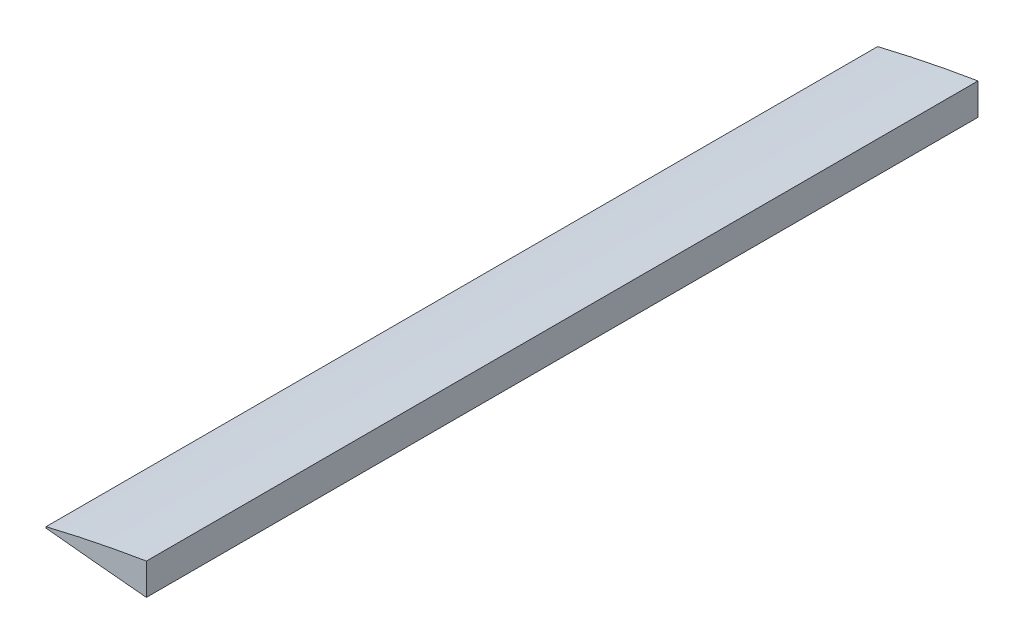
ISO-10303-21;
HEADER;
FILE_DESCRIPTION(('STEP AP214'),'2;1');
FILE_NAME('part.step','',(''),(''),'','','');
FILE_SCHEMA(('AUTOMOTIVE_DESIGN { 1 0 10303 214 1 1 1 1 }'));
ENDSEC;
DATA;
#1=APPLICATION_CONTEXT('core data for automotive mechanical design processes');
#2=APPLICATION_PROTOCOL_DEFINITION('international standard','automotive_design',2000,#1);
#3=PRODUCT_CONTEXT('',#1,'mechanical');
#4=PRODUCT('Part','Part','',(#3));
#5=PRODUCT_RELATED_PRODUCT_CATEGORY('part','',(#4));
#6=PRODUCT_DEFINITION_FORMATION('','',#4);
#7=PRODUCT_DEFINITION_CONTEXT('part definition',#1,'design');
#8=PRODUCT_DEFINITION('design','',#6,#7);
#9=PRODUCT_DEFINITION_SHAPE('','',#8);
#10=(LENGTH_UNIT() NAMED_UNIT(*) SI_UNIT(.MILLI.,.METRE.));
#11=(NAMED_UNIT(*) PLANE_ANGLE_UNIT() SI_UNIT($,.RADIAN.));
#12=(NAMED_UNIT(*) SI_UNIT($,.STERADIAN.) SOLID_ANGLE_UNIT());
#13=UNCERTAINTY_MEASURE_WITH_UNIT(LENGTH_MEASURE(1.E-05),#10,'distance_accuracy_value','');
#14=(GEOMETRIC_REPRESENTATION_CONTEXT(3) GLOBAL_UNCERTAINTY_ASSIGNED_CONTEXT((#13)) GLOBAL_UNIT_ASSIGNED_CONTEXT((#10,
#11,#12)) REPRESENTATION_CONTEXT('',''));
#15=CARTESIAN_POINT('',(0.,0.,0.));
#16=DIRECTION('',(0.,0.,1.));
#17=DIRECTION('',(1.,0.,0.));
#18=AXIS2_PLACEMENT_3D('',#15,#16,#17);
#19=CARTESIAN_POINT('',(-210.29024,15.5058314522249,612.));
#20=CARTESIAN_POINT('',(-212.448163353275,15.1479340687311,612.));
#21=CARTESIAN_POINT('',(-217.698820474475,14.2770984839323,612.));
#22=CARTESIAN_POINT('',(-225.855056301461,12.8241428399332,612.));
#23=CARTESIAN_POINT('',(-234.57385963361,11.2047682892585,612.));
#24=CARTESIAN_POINT('',(-242.716368314428,9.61995396378064,612.));
#25=CARTESIAN_POINT('',(-250.234652112608,8.09676921778001,612.));
#26=CARTESIAN_POINT('',(-257.0840012335,6.6572410943926,612.));
#27=CARTESIAN_POINT('',(-263.224123516304,5.32391997928555,612.));
#28=CARTESIAN_POINT('',(-268.619097385422,4.11810915980885,612.));
#29=CARTESIAN_POINT('',(-273.237578484398,3.05976006784548,612.));
#30=CARTESIAN_POINT('',(-277.052897894547,2.16689109478463,612.));
#31=CARTESIAN_POINT('',(-280.043162129704,1.45515688166644,612.));
#32=CARTESIAN_POINT('',(-282.191276140311,0.937226777434344,612.));
#33=CARTESIAN_POINT('',(-283.475130042903,0.625092250465188,612.));
#34=CARTESIAN_POINT('',(-284.041595767765,0.486694399645982,612.));
#35=CARTESIAN_POINT('',(-284.176,0.453857007963045,612.));
#36=B_SPLINE_CURVE_WITH_KNOTS('',3,(#19,#20,#21,#22,#23,#24,#25,#26,#27,#28,#29,#30,#31,#32,#33,
#34,#35),.UNSPECIFIED.,.F.,.F.,(4,1,1,1,1,1,1,1,1,1,1,1,1,1,4),(0.,0.0870070051452901,
0.21170536500617,0.329527112719374,0.439740644540536,0.541660709078569,0.634652346186562,
0.718134668905483,0.791584505134145,0.854539888493236,0.906603358473801,0.947445002011979,
0.976805146454738,0.994496601743555,1.),.UNSPECIFIED.);
#37=DIRECTION('',(0.,0.,-1.));
#38=VECTOR('',#37,1.);
#39=SURFACE_OF_LINEAR_EXTRUSION('',#36,#38);
#40=CARTESIAN_POINT('',(-210.29024,15.5058314522249,0.));
#41=CARTESIAN_POINT('',(-212.448163353275,15.1479340687311,0.));
#42=CARTESIAN_POINT('',(-217.698820474475,14.2770984839323,0.));
#43=CARTESIAN_POINT('',(-225.855056301461,12.8241428399332,0.));
#44=CARTESIAN_POINT('',(-234.57385963361,11.2047682892585,0.));
#45=CARTESIAN_POINT('',(-242.716368314428,9.61995396378064,0.));
#46=CARTESIAN_POINT('',(-250.234652112608,8.09676921778001,0.));
#47=CARTESIAN_POINT('',(-257.0840012335,6.6572410943926,0.));
#48=CARTESIAN_POINT('',(-263.224123516304,5.32391997928555,0.));
#49=CARTESIAN_POINT('',(-268.619097385422,4.11810915980885,0.));
#50=CARTESIAN_POINT('',(-273.237578484398,3.05976006784548,0.));
#51=CARTESIAN_POINT('',(-277.052897894547,2.16689109478463,0.));
#52=CARTESIAN_POINT('',(-280.043162129704,1.45515688166644,0.));
#53=CARTESIAN_POINT('',(-282.191276140311,0.937226777434344,0.));
#54=CARTESIAN_POINT('',(-283.475130042903,0.625092250465188,0.));
#55=CARTESIAN_POINT('',(-284.041595767765,0.486694399645982,0.));
#56=CARTESIAN_POINT('',(-284.176,0.453857007963045,0.));
#57=B_SPLINE_CURVE_WITH_KNOTS('',3,(#40,#41,#42,#43,#44,#45,#46,#47,#48,#49,#50,#51,#52,#53,#54,
#55,#56),.UNSPECIFIED.,.F.,.F.,(4,1,1,1,1,1,1,1,1,1,1,1,1,1,4),(0.,0.0870070051452901,
0.21170536500617,0.329527112719374,0.439740644540536,0.541660709078569,0.634652346186562,
0.718134668905483,0.791584505134145,0.854539888493236,0.906603358473801,0.947445002011979,
0.976805146454738,0.994496601743555,1.),.UNSPECIFIED.);
#58=CARTESIAN_POINT('',(-210.29024,15.5058314522249,0.));
#59=VERTEX_POINT('',#58);
#60=CARTESIAN_POINT('',(-284.176,0.453857007963045,0.));
#61=VERTEX_POINT('',#60);
#62=EDGE_CURVE('E134',#59,#61,#57,.T.);
#63=ORIENTED_EDGE('',*,*,#62,.T.);
#64=DIRECTION('',(0.,0.,-1.));
#65=VECTOR('',#64,1.);
#66=CARTESIAN_POINT('',(-284.176,0.453857007963045,612.));
#67=LINE('',#66,#65);
#68=CARTESIAN_POINT('',(-284.176,0.453857007963045,612.));
#69=VERTEX_POINT('',#68);
#70=EDGE_CURVE('E184',#69,#61,#67,.T.);
#71=ORIENTED_EDGE('',*,*,#70,.F.);
#72=CARTESIAN_POINT('',(-210.29024,15.5058314522249,612.));
#73=VERTEX_POINT('',#72);
#74=EDGE_CURVE('E147',#73,#69,#36,.T.);
#75=ORIENTED_EDGE('',*,*,#74,.F.);
#76=DIRECTION('',(0.,0.,-1.));
#77=VECTOR('',#76,1.);
#78=CARTESIAN_POINT('',(-210.29024,15.5058314522249,612.));
#79=LINE('',#78,#77);
#80=EDGE_CURVE('E204',#73,#59,#79,.T.);
#81=ORIENTED_EDGE('',*,*,#80,.T.);
#82=EDGE_LOOP('',(#63,#71,#75,#81));
#83=FACE_BOUND('',#82,.T.);
#84=ADVANCED_FACE('F39',(#83),#39,.F.);
#85=CARTESIAN_POINT('',(-284.176,0.453857007963045,612.));
#86=DIRECTION('',(1.,0.,0.));
#87=DIRECTION('',(0.,0.,-1.));
#88=AXIS2_PLACEMENT_3D('',#85,#86,#87);
#89=PLANE('',#88);
#90=DIRECTION('',(0.,-1.,0.));
#91=VECTOR('',#90,1.);
#92=CARTESIAN_POINT('',(-284.176,0.453857007963045,0.));
#93=LINE('',#92,#91);
#94=CARTESIAN_POINT('',(-284.176,-0.446585887155011,0.));
#95=VERTEX_POINT('',#94);
#96=EDGE_CURVE('E179',#61,#95,#93,.T.);
#97=ORIENTED_EDGE('',*,*,#96,.T.);
#98=DIRECTION('',(0.,0.,-1.));
#99=VECTOR('',#98,1.);
#100=CARTESIAN_POINT('',(-284.176,-0.446585887155011,612.));
#101=LINE('',#100,#99);
#102=CARTESIAN_POINT('',(-284.176,-0.446585887155011,612.));
#103=VERTEX_POINT('',#102);
#104=EDGE_CURVE('E181',#103,#95,#101,.T.);
#105=ORIENTED_EDGE('',*,*,#104,.F.);
#106=DIRECTION('',(0.,-1.,0.));
#107=VECTOR('',#106,1.);
#108=CARTESIAN_POINT('',(-284.176,0.453857007963045,612.));
#109=LINE('',#108,#107);
#110=EDGE_CURVE('E94',#69,#103,#109,.T.);
#111=ORIENTED_EDGE('',*,*,#110,.F.);
#112=ORIENTED_EDGE('',*,*,#70,.T.);
#113=EDGE_LOOP('',(#97,#105,#111,#112));
#114=FACE_BOUND('',#113,.T.);
#115=ADVANCED_FACE('F170',(#114),#89,.F.);
#116=CARTESIAN_POINT('',(-284.176,-0.446585887155011,612.));
#117=CARTESIAN_POINT('',(-284.166073983192,-0.446550556465792,612.));
#118=CARTESIAN_POINT('',(-284.007600869438,-0.445986486865687,612.));
#119=CARTESIAN_POINT('',(-283.409976300944,-0.546659804662299,612.));
#120=CARTESIAN_POINT('',(-282.084971372146,-0.653321357836059,612.));
#121=CARTESIAN_POINT('',(-279.890503933711,-0.906023665877273,612.));
#122=CARTESIAN_POINT('',(-276.83669848881,-1.21907284104337,612.));
#123=CARTESIAN_POINT('',(-272.945834405881,-1.6281931925168,612.));
#124=CARTESIAN_POINT('',(-268.242600772352,-2.11178080190877,612.));
#125=CARTESIAN_POINT('',(-262.758082865926,-2.67007960663762,612.));
#126=CARTESIAN_POINT('',(-256.527861272268,-3.29477004091561,612.));
#127=CARTESIAN_POINT('',(-249.592304466849,-3.98011450002054,612.));
#128=CARTESIAN_POINT('',(-241.996045088026,-4.71925279025023,612.));
#129=CARTESIAN_POINT('',(-233.787735511311,-5.50572775187703,612.));
#130=CARTESIAN_POINT('',(-225.019553340548,-6.33168785215731,612.));
#131=CARTESIAN_POINT('',(-217.124973788987,-7.06522307018421,612.));
#132=CARTESIAN_POINT('',(-212.158655952302,-7.51544881591709,612.));
#133=CARTESIAN_POINT('',(-210.29024,-7.68483164503255,612.));
#134=B_SPLINE_CURVE_WITH_KNOTS('',3,(#116,#117,#118,#119,#120,#121,#122,#123,#124,#125,#126,
#127,#128,#129,#130,#131,#132,#133),.UNSPECIFIED.,.F.,.F.,(4,1,1,1,1,1,1,1,1,1,1,1,1,1,1,4),(0.,
0.000401027004237275,0.00640256804801398,0.0243667405419057,0.0541726551316402,
0.0956203448841406,0.148432949269866,0.212259606924723,0.286678920603446,0.371202853061501,
0.465280924763119,0.568304609739684,0.67961185947699,0.798491720853711,0.924189047970983,1.),.UNSPECIFIED.);
#135=DIRECTION('',(0.,0.,-1.));
#136=VECTOR('',#135,1.);
#137=SURFACE_OF_LINEAR_EXTRUSION('',#134,#136);
#138=DIRECTION('',(0.,0.,-1.));
#139=VECTOR('',#138,1.);
#140=CARTESIAN_POINT('',(-233.632,-5.51822994875993,612.));
#141=LINE('',#140,#139);
#142=CARTESIAN_POINT('',(-233.632,-5.5182299496552,96.8999999999999));
#143=VERTEX_POINT('',#142);
#144=CARTESIAN_POINT('',(-233.631999990573,-5.5182299496552,83.8999999999999));
#145=VERTEX_POINT('',#144);
#146=EDGE_CURVE('E49',#143,#145,#141,.T.);
#147=ORIENTED_EDGE('',*,*,#146,.F.);
#148=CARTESIAN_POINT('',(-284.176,-0.446585887155011,96.9));
#149=CARTESIAN_POINT('',(-284.166073983192,-0.446550556465792,96.9));
#150=CARTESIAN_POINT('',(-284.007600869438,-0.445986486865687,96.9));
#151=CARTESIAN_POINT('',(-283.409976300944,-0.546659804662299,96.9));
#152=CARTESIAN_POINT('',(-282.084971372146,-0.653321357836059,96.9));
#153=CARTESIAN_POINT('',(-279.890503933711,-0.906023665877273,96.9));
#154=CARTESIAN_POINT('',(-276.83669848881,-1.21907284104337,96.9));
#155=CARTESIAN_POINT('',(-272.945834405881,-1.6281931925168,96.9));
#156=CARTESIAN_POINT('',(-268.242600772352,-2.11178080190877,96.9));
#157=CARTESIAN_POINT('',(-262.758082865926,-2.67007960663762,96.9));
#158=CARTESIAN_POINT('',(-256.527861272268,-3.29477004091561,96.9));
#159=CARTESIAN_POINT('',(-249.592304466849,-3.98011450002054,96.9));
#160=CARTESIAN_POINT('',(-241.996045088026,-4.71925279025023,96.9));
#161=CARTESIAN_POINT('',(-233.787735511311,-5.50572775187703,96.9));
#162=CARTESIAN_POINT('',(-225.019553340548,-6.33168785215731,96.9));
#163=CARTESIAN_POINT('',(-217.124973788987,-7.06522307018421,96.9));
#164=CARTESIAN_POINT('',(-212.158655952302,-7.51544881591709,96.9));
#165=CARTESIAN_POINT('',(-210.29024,-7.68483164503255,96.9));
#166=B_SPLINE_CURVE_WITH_KNOTS('',3,(#148,#149,#150,#151,#152,#153,#154,#155,#156,#157,#158,
#159,#160,#161,#162,#163,#164,#165),.UNSPECIFIED.,.F.,.F.,(4,1,1,1,1,1,1,1,1,1,1,1,1,1,1,4),(0.,
0.000401027004237275,0.00640256804801398,0.0243667405419057,0.0541726551316402,
0.0956203448841406,0.148432949269866,0.212259606924723,0.286678920603446,0.371202853061501,
0.465280924763119,0.568304609739684,0.67961185947699,0.798491720853711,0.924189047970983,1.),.UNSPECIFIED.);
#167=CARTESIAN_POINT('',(-212.632,-7.47242156767323,96.8999999999999));
#168=VERTEX_POINT('',#167);
#169=EDGE_CURVE('E11',#143,#168,#166,.T.);
#170=ORIENTED_EDGE('',*,*,#169,.T.);
#171=DIRECTION('',(0.,0.,-1.));
#172=VECTOR('',#171,1.);
#173=CARTESIAN_POINT('',(-212.632,-7.47242156767323,612.));
#174=LINE('',#173,#172);
#175=CARTESIAN_POINT('',(-212.632,-7.47242156767323,83.8999999999999));
#176=VERTEX_POINT('',#175);
#177=EDGE_CURVE('E123',#176,#168,#174,.F.);
#178=ORIENTED_EDGE('',*,*,#177,.F.);
#179=CARTESIAN_POINT('',(-284.176,-0.446585887155011,83.8999999999999));
#180=CARTESIAN_POINT('',(-284.166073983192,-0.446550556465792,83.8999999999999));
#181=CARTESIAN_POINT('',(-284.007600869438,-0.445986486865687,83.8999999999999));
#182=CARTESIAN_POINT('',(-283.409976300944,-0.546659804662299,83.8999999999999));
#183=CARTESIAN_POINT('',(-282.084971372146,-0.653321357836059,83.8999999999999));
#184=CARTESIAN_POINT('',(-279.890503933711,-0.906023665877273,83.8999999999999));
#185=CARTESIAN_POINT('',(-276.83669848881,-1.21907284104337,83.8999999999999));
#186=CARTESIAN_POINT('',(-272.945834405881,-1.6281931925168,83.8999999999999));
#187=CARTESIAN_POINT('',(-268.242600772352,-2.11178080190877,83.8999999999999));
#188=CARTESIAN_POINT('',(-262.758082865926,-2.67007960663762,83.8999999999999));
#189=CARTESIAN_POINT('',(-256.527861272268,-3.29477004091561,83.8999999999999));
#190=CARTESIAN_POINT('',(-249.592304466849,-3.98011450002054,83.8999999999999));
#191=CARTESIAN_POINT('',(-241.996045088026,-4.71925279025023,83.8999999999999));
#192=CARTESIAN_POINT('',(-233.787735511311,-5.50572775187703,83.8999999999999));
#193=CARTESIAN_POINT('',(-225.019553340548,-6.33168785215731,83.8999999999999));
#194=CARTESIAN_POINT('',(-217.124973788987,-7.06522307018421,83.8999999999999));
#195=CARTESIAN_POINT('',(-212.158655952302,-7.51544881591709,83.8999999999999));
#196=CARTESIAN_POINT('',(-210.29024,-7.68483164503255,83.8999999999999));
#197=B_SPLINE_CURVE_WITH_KNOTS('',3,(#179,#180,#181,#182,#183,#184,#185,#186,#187,#188,#189,
#190,#191,#192,#193,#194,#195,#196),.UNSPECIFIED.,.F.,.F.,(4,1,1,1,1,1,1,1,1,1,1,1,1,1,1,4),(0.,
0.000401027004237275,0.00640256804801398,0.0243667405419057,0.0541726551316402,
0.0956203448841406,0.148432949269866,0.212259606924723,0.286678920603446,0.371202853061501,
0.465280924763119,0.568304609739684,0.67961185947699,0.798491720853711,0.924189047970983,1.),.UNSPECIFIED.);
#198=EDGE_CURVE('E208',#145,#176,#197,.T.);
#199=ORIENTED_EDGE('',*,*,#198,.F.);
#200=EDGE_LOOP('',(#147,#170,#178,#199));
#201=FACE_BOUND('',#200,.T.);
#202=CARTESIAN_POINT('',(-284.176,-0.446585887155011,0.));
#203=CARTESIAN_POINT('',(-284.166073983192,-0.446550556465792,0.));
#204=CARTESIAN_POINT('',(-284.007600869438,-0.445986486865687,0.));
#205=CARTESIAN_POINT('',(-283.409976300944,-0.546659804662299,0.));
#206=CARTESIAN_POINT('',(-282.084971372146,-0.653321357836059,0.));
#207=CARTESIAN_POINT('',(-279.890503933711,-0.906023665877273,0.));
#208=CARTESIAN_POINT('',(-276.83669848881,-1.21907284104337,0.));
#209=CARTESIAN_POINT('',(-272.945834405881,-1.6281931925168,0.));
#210=CARTESIAN_POINT('',(-268.242600772352,-2.11178080190877,0.));
#211=CARTESIAN_POINT('',(-262.758082865926,-2.67007960663762,0.));
#212=CARTESIAN_POINT('',(-256.527861272268,-3.29477004091561,0.));
#213=CARTESIAN_POINT('',(-249.592304466849,-3.98011450002054,0.));
#214=CARTESIAN_POINT('',(-241.996045088026,-4.71925279025023,0.));
#215=CARTESIAN_POINT('',(-233.787735511311,-5.50572775187703,0.));
#216=CARTESIAN_POINT('',(-225.019553340548,-6.33168785215731,0.));
#217=CARTESIAN_POINT('',(-217.124973788987,-7.06522307018421,0.));
#218=CARTESIAN_POINT('',(-212.158655952302,-7.51544881591709,0.));
#219=CARTESIAN_POINT('',(-210.29024,-7.68483164503255,0.));
#220=B_SPLINE_CURVE_WITH_KNOTS('',3,(#202,#203,#204,#205,#206,#207,#208,#209,#210,#211,#212,
#213,#214,#215,#216,#217,#218,#219),.UNSPECIFIED.,.F.,.F.,(4,1,1,1,1,1,1,1,1,1,1,1,1,1,1,4),(0.,
0.000401027004237275,0.00640256804801398,0.0243667405419057,0.0541726551316402,
0.0956203448841406,0.148432949269866,0.212259606924723,0.286678920603446,0.371202853061501,
0.465280924763119,0.568304609739684,0.67961185947699,0.798491720853711,0.924189047970983,1.),.UNSPECIFIED.);
#221=CARTESIAN_POINT('',(-210.29024,-7.68483164503255,0.));
#222=VERTEX_POINT('',#221);
#223=EDGE_CURVE('E189',#95,#222,#220,.T.);
#224=ORIENTED_EDGE('',*,*,#223,.T.);
#225=DIRECTION('',(0.,0.,-1.));
#226=VECTOR('',#225,1.);
#227=CARTESIAN_POINT('',(-210.29024,-7.68483164503255,612.));
#228=LINE('',#227,#226);
#229=CARTESIAN_POINT('',(-210.29024,-7.68483164503255,612.));
#230=VERTEX_POINT('',#229);
#231=EDGE_CURVE('E193',#230,#222,#228,.T.);
#232=ORIENTED_EDGE('',*,*,#231,.F.);
#233=EDGE_CURVE('E156',#103,#230,#134,.T.);
#234=ORIENTED_EDGE('',*,*,#233,.F.);
#235=ORIENTED_EDGE('',*,*,#104,.T.);
#236=EDGE_LOOP('',(#224,#232,#234,#235));
#237=FACE_BOUND('',#236,.T.);
#238=ADVANCED_FACE('F166',(#201,#237),#137,.F.);
#239=CARTESIAN_POINT('',(-210.29024,15.5058314522249,612.));
#240=DIRECTION('',(-1.,0.,0.));
#241=DIRECTION('',(0.,0.,1.));
#242=AXIS2_PLACEMENT_3D('',#239,#240,#241);
#243=PLANE('',#242);
#244=DIRECTION('',(0.,1.,0.));
#245=VECTOR('',#244,1.);
#246=CARTESIAN_POINT('',(-210.29024,15.5058314522249,0.));
#247=LINE('',#246,#245);
#248=EDGE_CURVE('E86',#222,#59,#247,.T.);
#249=ORIENTED_EDGE('',*,*,#248,.T.);
#250=ORIENTED_EDGE('',*,*,#80,.F.);
#251=DIRECTION('',(0.,1.,0.));
#252=VECTOR('',#251,1.);
#253=CARTESIAN_POINT('',(-210.29024,15.5058314522249,612.));
#254=LINE('',#253,#252);
#255=EDGE_CURVE('E65',#230,#73,#254,.T.);
#256=ORIENTED_EDGE('',*,*,#255,.F.);
#257=ORIENTED_EDGE('',*,*,#231,.T.);
#258=EDGE_LOOP('',(#249,#250,#256,#257));
#259=FACE_BOUND('',#258,.T.);
#260=ADVANCED_FACE('F169',(#259),#243,.F.);
#261=CARTESIAN_POINT('',(-247.374557249018,8.67350765840326,612.));
#262=DIRECTION('',(0.,0.,-1.));
#263=DIRECTION('',(-1.,0.,0.));
#264=AXIS2_PLACEMENT_3D('',#261,#262,#263);
#265=PLANE('',#264);
#266=ORIENTED_EDGE('',*,*,#74,.T.);
#267=ORIENTED_EDGE('',*,*,#110,.T.);
#268=ORIENTED_EDGE('',*,*,#233,.T.);
#269=ORIENTED_EDGE('',*,*,#255,.T.);
#270=EDGE_LOOP('',(#266,#267,#268,#269));
#271=FACE_BOUND('',#270,.T.);
#272=ADVANCED_FACE('F233',(#271),#265,.F.);
#273=CARTESIAN_POINT('',(-247.374557249018,8.67350765840326,0.));
#274=DIRECTION('',(0.,0.,-1.));
#275=DIRECTION('',(-1.,0.,0.));
#276=AXIS2_PLACEMENT_3D('',#273,#274,#275);
#277=PLANE('',#276);
#278=ORIENTED_EDGE('',*,*,#62,.F.);
#279=ORIENTED_EDGE('',*,*,#248,.F.);
#280=ORIENTED_EDGE('',*,*,#223,.F.);
#281=ORIENTED_EDGE('',*,*,#96,.F.);
#282=EDGE_LOOP('',(#278,#279,#280,#281));
#283=FACE_BOUND('',#282,.T.);
#284=ADVANCED_FACE('F195',(#283),#277,.T.);
#285=CARTESIAN_POINT('',(-233.632,3.308,96.8999999999999));
#286=DIRECTION('',(1.,0.,0.));
#287=DIRECTION('',(0.,0.,-1.));
#288=AXIS2_PLACEMENT_3D('',#285,#286,#287);
#289=PLANE('',#288);
#290=ORIENTED_EDGE('',*,*,#146,.T.);
#291=DIRECTION('',(0.,-1.,0.));
#292=VECTOR('',#291,1.);
#293=CARTESIAN_POINT('',(-233.632,3.308,83.8999999999999));
#294=LINE('',#293,#292);
#295=CARTESIAN_POINT('',(-233.632,3.308,83.8999999999999));
#296=VERTEX_POINT('',#295);
#297=EDGE_CURVE('E56',#296,#145,#294,.T.);
#298=ORIENTED_EDGE('',*,*,#297,.F.);
#299=DIRECTION('',(0.,0.,-1.));
#300=VECTOR('',#299,1.);
#301=CARTESIAN_POINT('',(-233.632,3.308,96.8999999999999));
#302=LINE('',#301,#300);
#303=CARTESIAN_POINT('',(-233.632,3.308,96.8999999999999));
#304=VERTEX_POINT('',#303);
#305=EDGE_CURVE('E135',#304,#296,#302,.T.);
#306=ORIENTED_EDGE('',*,*,#305,.F.);
#307=DIRECTION('',(0.,-1.,0.));
#308=VECTOR('',#307,1.);
#309=CARTESIAN_POINT('',(-233.632,3.308,96.8999999999999));
#310=LINE('',#309,#308);
#311=EDGE_CURVE('E127',#304,#143,#310,.T.);
#312=ORIENTED_EDGE('',*,*,#311,.T.);
#313=EDGE_LOOP('',(#290,#298,#306,#312));
#314=FACE_BOUND('',#313,.T.);
#315=ADVANCED_FACE('F218',(#314),#289,.T.);
#316=CARTESIAN_POINT('',(-212.632,-8.192,96.8999999999999));
#317=DIRECTION('',(-1.,0.,0.));
#318=DIRECTION('',(0.,0.,1.));
#319=AXIS2_PLACEMENT_3D('',#316,#317,#318);
#320=PLANE('',#319);
#321=ORIENTED_EDGE('',*,*,#177,.T.);
#322=DIRECTION('',(0.,1.,0.));
#323=VECTOR('',#322,1.);
#324=CARTESIAN_POINT('',(-212.632,-8.192,96.8999999999999));
#325=LINE('',#324,#323);
#326=CARTESIAN_POINT('',(-212.632,3.308,96.8999999999999));
#327=VERTEX_POINT('',#326);
#328=EDGE_CURVE('E116',#168,#327,#325,.T.);
#329=ORIENTED_EDGE('',*,*,#328,.T.);
#330=DIRECTION('',(0.,0.,-1.));
#331=VECTOR('',#330,1.);
#332=CARTESIAN_POINT('',(-212.632,3.308,96.8999999999999));
#333=LINE('',#332,#331);
#334=CARTESIAN_POINT('',(-212.632,3.308,83.8999999999999));
#335=VERTEX_POINT('',#334);
#336=EDGE_CURVE('E120',#327,#335,#333,.T.);
#337=ORIENTED_EDGE('',*,*,#336,.T.);
#338=DIRECTION('',(0.,1.,0.));
#339=VECTOR('',#338,1.);
#340=CARTESIAN_POINT('',(-212.632,-8.192,83.8999999999999));
#341=LINE('',#340,#339);
#342=EDGE_CURVE('E145',#176,#335,#341,.T.);
#343=ORIENTED_EDGE('',*,*,#342,.F.);
#344=EDGE_LOOP('',(#321,#329,#337,#343));
#345=FACE_BOUND('',#344,.T.);
#346=ADVANCED_FACE('F118',(#345),#320,.T.);
#347=CARTESIAN_POINT('',(0.,0.,96.8999999999999));
#348=DIRECTION('',(0.,0.,1.));
#349=DIRECTION('',(1.,0.,0.));
#350=AXIS2_PLACEMENT_3D('',#347,#348,#349);
#351=PLANE('',#350);
#352=ORIENTED_EDGE('',*,*,#311,.F.);
#353=DIRECTION('',(-1.,0.,0.));
#354=VECTOR('',#353,1.);
#355=CARTESIAN_POINT('',(-212.632,3.308,96.8999999999999));
#356=LINE('',#355,#354);
#357=EDGE_CURVE('E126',#327,#304,#356,.T.);
#358=ORIENTED_EDGE('',*,*,#357,.F.);
#359=ORIENTED_EDGE('',*,*,#328,.F.);
#360=ORIENTED_EDGE('',*,*,#169,.F.);
#361=EDGE_LOOP('',(#352,#358,#359,#360));
#362=FACE_BOUND('',#361,.T.);
#363=ADVANCED_FACE('F138',(#362),#351,.F.);
#364=CARTESIAN_POINT('',(0.,0.,83.8999999999999));
#365=DIRECTION('',(0.,0.,1.));
#366=DIRECTION('',(1.,0.,0.));
#367=AXIS2_PLACEMENT_3D('',#364,#365,#366);
#368=PLANE('',#367);
#369=ORIENTED_EDGE('',*,*,#198,.T.);
#370=ORIENTED_EDGE('',*,*,#342,.T.);
#371=DIRECTION('',(-1.,0.,0.));
#372=VECTOR('',#371,1.);
#373=CARTESIAN_POINT('',(-212.632,3.308,83.8999999999999));
#374=LINE('',#373,#372);
#375=EDGE_CURVE('E133',#335,#296,#374,.T.);
#376=ORIENTED_EDGE('',*,*,#375,.T.);
#377=ORIENTED_EDGE('',*,*,#297,.T.);
#378=EDGE_LOOP('',(#369,#370,#376,#377));
#379=FACE_BOUND('',#378,.T.);
#380=ADVANCED_FACE('F219',(#379),#368,.T.);
#381=CARTESIAN_POINT('',(-212.632,3.308,96.8999999999999));
#382=DIRECTION('',(0.,-1.,0.));
#383=DIRECTION('',(0.,0.,-1.));
#384=AXIS2_PLACEMENT_3D('',#381,#382,#383);
#385=PLANE('',#384);
#386=ORIENTED_EDGE('',*,*,#375,.F.);
#387=ORIENTED_EDGE('',*,*,#336,.F.);
#388=ORIENTED_EDGE('',*,*,#357,.T.);
#389=ORIENTED_EDGE('',*,*,#305,.T.);
#390=EDGE_LOOP('',(#386,#387,#388,#389));
#391=FACE_BOUND('',#390,.T.);
#392=ADVANCED_FACE('F130',(#391),#385,.T.);
#393=CLOSED_SHELL('',(#84,#115,#238,#260,#272,#284,#315,#346,#363,#380,#392));
#394=MANIFOLD_SOLID_BREP('B2',#393);
#395=ADVANCED_BREP_SHAPE_REPRESENTATION('',(#18,#394),#14);
#396=SHAPE_DEFINITION_REPRESENTATION(#9,#395);
ENDSEC;
END-ISO-10303-21;
